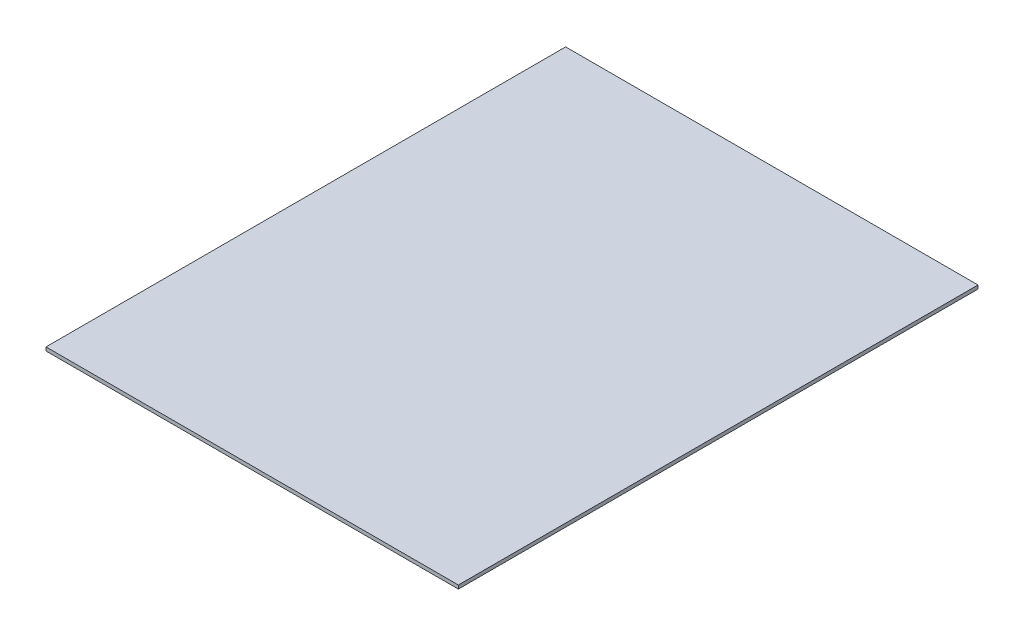
ISO-10303-21;
HEADER;
FILE_DESCRIPTION(('STEP AP214'),'2;1');
FILE_NAME('part.step','',(''),(''),'','','');
FILE_SCHEMA(('AUTOMOTIVE_DESIGN { 1 0 10303 214 1 1 1 1 }'));
ENDSEC;
DATA;
#1=APPLICATION_CONTEXT('core data for automotive mechanical design processes');
#2=APPLICATION_PROTOCOL_DEFINITION('international standard','automotive_design',2000,#1);
#3=PRODUCT_CONTEXT('',#1,'mechanical');
#4=PRODUCT('Part','Part','',(#3));
#5=PRODUCT_RELATED_PRODUCT_CATEGORY('part','',(#4));
#6=PRODUCT_DEFINITION_FORMATION('','',#4);
#7=PRODUCT_DEFINITION_CONTEXT('part definition',#1,'design');
#8=PRODUCT_DEFINITION('design','',#6,#7);
#9=PRODUCT_DEFINITION_SHAPE('','',#8);
#10=(LENGTH_UNIT() NAMED_UNIT(*) SI_UNIT(.MILLI.,.METRE.));
#11=(NAMED_UNIT(*) PLANE_ANGLE_UNIT() SI_UNIT($,.RADIAN.));
#12=(NAMED_UNIT(*) SI_UNIT($,.STERADIAN.) SOLID_ANGLE_UNIT());
#13=UNCERTAINTY_MEASURE_WITH_UNIT(LENGTH_MEASURE(1.E-05),#10,'distance_accuracy_value','');
#14=(GEOMETRIC_REPRESENTATION_CONTEXT(3) GLOBAL_UNCERTAINTY_ASSIGNED_CONTEXT((#13)) GLOBAL_UNIT_ASSIGNED_CONTEXT((#10,
#11,#12)) REPRESENTATION_CONTEXT('',''));
#15=CARTESIAN_POINT('',(0.,0.,0.));
#16=DIRECTION('',(0.,0.,1.));
#17=DIRECTION('',(1.,0.,0.));
#18=AXIS2_PLACEMENT_3D('',#15,#16,#17);
#19=CARTESIAN_POINT('',(0.,3.,0.));
#20=DIRECTION('',(-1.,0.,0.));
#21=DIRECTION('',(0.,0.,1.));
#22=AXIS2_PLACEMENT_3D('',#19,#20,#21);
#23=PLANE('',#22);
#24=DIRECTION('',(0.,0.,-1.));
#25=VECTOR('',#24,1.);
#26=CARTESIAN_POINT('',(0.,0.,0.));
#27=LINE('',#26,#25);
#28=CARTESIAN_POINT('',(0.,0.,0.));
#29=VERTEX_POINT('',#28);
#30=CARTESIAN_POINT('',(0.,0.,-436.));
#31=VERTEX_POINT('',#30);
#32=EDGE_CURVE('E95',#29,#31,#27,.T.);
#33=ORIENTED_EDGE('',*,*,#32,.T.);
#34=DIRECTION('',(0.,-1.,0.));
#35=VECTOR('',#34,1.);
#36=CARTESIAN_POINT('',(0.,3.,-436.));
#37=LINE('',#36,#35);
#38=CARTESIAN_POINT('',(0.,3.,-436.));
#39=VERTEX_POINT('',#38);
#40=EDGE_CURVE('E11',#39,#31,#37,.T.);
#41=ORIENTED_EDGE('',*,*,#40,.F.);
#42=DIRECTION('',(0.,0.,-1.));
#43=VECTOR('',#42,1.);
#44=CARTESIAN_POINT('',(0.,3.,0.));
#45=LINE('',#44,#43);
#46=CARTESIAN_POINT('',(0.,3.,0.));
#47=VERTEX_POINT('',#46);
#48=EDGE_CURVE('E83',#47,#39,#45,.T.);
#49=ORIENTED_EDGE('',*,*,#48,.F.);
#50=DIRECTION('',(0.,-1.,0.));
#51=VECTOR('',#50,1.);
#52=CARTESIAN_POINT('',(0.,3.,0.));
#53=LINE('',#52,#51);
#54=EDGE_CURVE('E91',#47,#29,#53,.T.);
#55=ORIENTED_EDGE('',*,*,#54,.T.);
#56=EDGE_LOOP('',(#33,#41,#49,#55));
#57=FACE_BOUND('',#56,.T.);
#58=ADVANCED_FACE('F32',(#57),#23,.F.);
#59=CARTESIAN_POINT('',(0.,3.,-436.));
#60=DIRECTION('',(0.,0.,1.));
#61=DIRECTION('',(1.,0.,0.));
#62=AXIS2_PLACEMENT_3D('',#59,#60,#61);
#63=PLANE('',#62);
#64=DIRECTION('',(-1.,0.,0.));
#65=VECTOR('',#64,1.);
#66=CARTESIAN_POINT('',(0.,0.,-436.));
#67=LINE('',#66,#65);
#68=CARTESIAN_POINT('',(-346.,0.,-436.));
#69=VERTEX_POINT('',#68);
#70=EDGE_CURVE('E87',#31,#69,#67,.T.);
#71=ORIENTED_EDGE('',*,*,#70,.T.);
#72=DIRECTION('',(0.,-1.,0.));
#73=VECTOR('',#72,1.);
#74=CARTESIAN_POINT('',(-346.,3.,-436.));
#75=LINE('',#74,#73);
#76=CARTESIAN_POINT('',(-346.,3.,-436.));
#77=VERTEX_POINT('',#76);
#78=EDGE_CURVE('E40',#77,#69,#75,.T.);
#79=ORIENTED_EDGE('',*,*,#78,.F.);
#80=DIRECTION('',(-1.,0.,0.));
#81=VECTOR('',#80,1.);
#82=CARTESIAN_POINT('',(0.,3.,-436.));
#83=LINE('',#82,#81);
#84=EDGE_CURVE('E78',#39,#77,#83,.T.);
#85=ORIENTED_EDGE('',*,*,#84,.F.);
#86=ORIENTED_EDGE('',*,*,#40,.T.);
#87=EDGE_LOOP('',(#71,#79,#85,#86));
#88=FACE_BOUND('',#87,.T.);
#89=ADVANCED_FACE('F86',(#88),#63,.F.);
#90=CARTESIAN_POINT('',(-346.,3.,0.));
#91=DIRECTION('',(1.,0.,0.));
#92=DIRECTION('',(0.,0.,-1.));
#93=AXIS2_PLACEMENT_3D('',#90,#91,#92);
#94=PLANE('',#93);
#95=DIRECTION('',(0.,0.,1.));
#96=VECTOR('',#95,1.);
#97=CARTESIAN_POINT('',(-346.,0.,0.));
#98=LINE('',#97,#96);
#99=CARTESIAN_POINT('',(-346.,0.,0.));
#100=VERTEX_POINT('',#99);
#101=EDGE_CURVE('E65',#69,#100,#98,.T.);
#102=ORIENTED_EDGE('',*,*,#101,.T.);
#103=DIRECTION('',(0.,-1.,0.));
#104=VECTOR('',#103,1.);
#105=CARTESIAN_POINT('',(-346.,3.,0.));
#106=LINE('',#105,#104);
#107=CARTESIAN_POINT('',(-346.,3.,0.));
#108=VERTEX_POINT('',#107);
#109=EDGE_CURVE('E88',#108,#100,#106,.T.);
#110=ORIENTED_EDGE('',*,*,#109,.F.);
#111=DIRECTION('',(0.,0.,1.));
#112=VECTOR('',#111,1.);
#113=CARTESIAN_POINT('',(-346.,3.,0.));
#114=LINE('',#113,#112);
#115=EDGE_CURVE('E81',#77,#108,#114,.T.);
#116=ORIENTED_EDGE('',*,*,#115,.F.);
#117=ORIENTED_EDGE('',*,*,#78,.T.);
#118=EDGE_LOOP('',(#102,#110,#116,#117));
#119=FACE_BOUND('',#118,.T.);
#120=ADVANCED_FACE('F89',(#119),#94,.F.);
#121=CARTESIAN_POINT('',(0.,3.,0.));
#122=DIRECTION('',(0.,0.,-1.));
#123=DIRECTION('',(-1.,0.,0.));
#124=AXIS2_PLACEMENT_3D('',#121,#122,#123);
#125=PLANE('',#124);
#126=DIRECTION('',(1.,0.,0.));
#127=VECTOR('',#126,1.);
#128=CARTESIAN_POINT('',(0.,0.,0.));
#129=LINE('',#128,#127);
#130=EDGE_CURVE('E71',#100,#29,#129,.T.);
#131=ORIENTED_EDGE('',*,*,#130,.T.);
#132=ORIENTED_EDGE('',*,*,#54,.F.);
#133=DIRECTION('',(1.,0.,0.));
#134=VECTOR('',#133,1.);
#135=CARTESIAN_POINT('',(0.,3.,0.));
#136=LINE('',#135,#134);
#137=EDGE_CURVE('E48',#108,#47,#136,.T.);
#138=ORIENTED_EDGE('',*,*,#137,.F.);
#139=ORIENTED_EDGE('',*,*,#109,.T.);
#140=EDGE_LOOP('',(#131,#132,#138,#139));
#141=FACE_BOUND('',#140,.T.);
#142=ADVANCED_FACE('F102',(#141),#125,.F.);
#143=CARTESIAN_POINT('',(0.,3.,0.));
#144=DIRECTION('',(0.,1.,0.));
#145=DIRECTION('',(0.,0.,1.));
#146=AXIS2_PLACEMENT_3D('',#143,#144,#145);
#147=PLANE('',#146);
#148=ORIENTED_EDGE('',*,*,#48,.T.);
#149=ORIENTED_EDGE('',*,*,#84,.T.);
#150=ORIENTED_EDGE('',*,*,#115,.T.);
#151=ORIENTED_EDGE('',*,*,#137,.T.);
#152=EDGE_LOOP('',(#148,#149,#150,#151));
#153=FACE_BOUND('',#152,.T.);
#154=ADVANCED_FACE('F79',(#153),#147,.T.);
#155=CARTESIAN_POINT('',(0.,0.,0.));
#156=DIRECTION('',(0.,1.,0.));
#157=DIRECTION('',(0.,0.,1.));
#158=AXIS2_PLACEMENT_3D('',#155,#156,#157);
#159=PLANE('',#158);
#160=ORIENTED_EDGE('',*,*,#32,.F.);
#161=ORIENTED_EDGE('',*,*,#130,.F.);
#162=ORIENTED_EDGE('',*,*,#101,.F.);
#163=ORIENTED_EDGE('',*,*,#70,.F.);
#164=EDGE_LOOP('',(#160,#161,#162,#163));
#165=FACE_BOUND('',#164,.T.);
#166=ADVANCED_FACE('F105',(#165),#159,.F.);
#167=CLOSED_SHELL('',(#58,#89,#120,#142,#154,#166));
#168=MANIFOLD_SOLID_BREP('B2',#167);
#169=ADVANCED_BREP_SHAPE_REPRESENTATION('',(#18,#168),#14);
#170=SHAPE_DEFINITION_REPRESENTATION(#9,#169);
ENDSEC;
END-ISO-10303-21;
